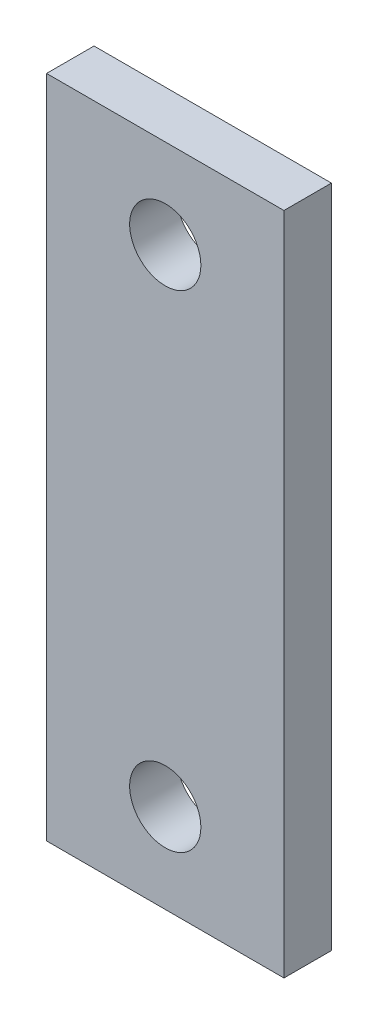
ISO-10303-21;
HEADER;
FILE_DESCRIPTION(('STEP AP214'),'2;1');
FILE_NAME('part.step','',(''),(''),'','','');
FILE_SCHEMA(('AUTOMOTIVE_DESIGN { 1 0 10303 214 1 1 1 1 }'));
ENDSEC;
DATA;
#1=APPLICATION_CONTEXT('core data for automotive mechanical design processes');
#2=APPLICATION_PROTOCOL_DEFINITION('international standard','automotive_design',2000,#1);
#3=PRODUCT_CONTEXT('',#1,'mechanical');
#4=PRODUCT('Part','Part','',(#3));
#5=PRODUCT_RELATED_PRODUCT_CATEGORY('part','',(#4));
#6=PRODUCT_DEFINITION_FORMATION('','',#4);
#7=PRODUCT_DEFINITION_CONTEXT('part definition',#1,'design');
#8=PRODUCT_DEFINITION('design','',#6,#7);
#9=PRODUCT_DEFINITION_SHAPE('','',#8);
#10=(LENGTH_UNIT() NAMED_UNIT(*) SI_UNIT(.MILLI.,.METRE.));
#11=(NAMED_UNIT(*) PLANE_ANGLE_UNIT() SI_UNIT($,.RADIAN.));
#12=(NAMED_UNIT(*) SI_UNIT($,.STERADIAN.) SOLID_ANGLE_UNIT());
#13=UNCERTAINTY_MEASURE_WITH_UNIT(LENGTH_MEASURE(1.E-05),#10,'distance_accuracy_value','');
#14=(GEOMETRIC_REPRESENTATION_CONTEXT(3) GLOBAL_UNCERTAINTY_ASSIGNED_CONTEXT((#13)) GLOBAL_UNIT_ASSIGNED_CONTEXT((#10,
#11,#12)) REPRESENTATION_CONTEXT('',''));
#15=CARTESIAN_POINT('',(0.,0.,0.));
#16=DIRECTION('',(0.,0.,1.));
#17=DIRECTION('',(1.,0.,0.));
#18=AXIS2_PLACEMENT_3D('',#15,#16,#17);
#19=CARTESIAN_POINT('',(15.2003440715172,13.7604472929724,35.));
#20=DIRECTION('',(-1.,0.,0.));
#21=DIRECTION('',(0.,0.,1.));
#22=AXIS2_PLACEMENT_3D('',#19,#20,#21);
#23=PLANE('',#22);
#24=DIRECTION('',(0.,-1.,0.));
#25=VECTOR('',#24,1.);
#26=CARTESIAN_POINT('',(15.2003440715172,19.7604472929724,4.));
#27=LINE('',#26,#25);
#28=CARTESIAN_POINT('',(15.2003440715172,34.7604472929724,4.));
#29=VERTEX_POINT('',#28);
#30=CARTESIAN_POINT('',(15.2003440715172,-21.2395527070276,4.));
#31=VERTEX_POINT('',#30);
#32=EDGE_CURVE('E83',#29,#31,#27,.T.);
#33=ORIENTED_EDGE('',*,*,#32,.T.);
#34=DIRECTION('',(0.,0.,-1.));
#35=VECTOR('',#34,1.);
#36=CARTESIAN_POINT('',(15.2003440715172,-21.2395527070276,0.));
#37=LINE('',#36,#35);
#38=CARTESIAN_POINT('',(15.2003440715172,-21.2395527070276,0.));
#39=VERTEX_POINT('',#38);
#40=EDGE_CURVE('E91',#31,#39,#37,.T.);
#41=ORIENTED_EDGE('',*,*,#40,.T.);
#42=DIRECTION('',(0.,1.,0.));
#43=VECTOR('',#42,1.);
#44=CARTESIAN_POINT('',(15.2003440715172,13.7604472929724,0.));
#45=LINE('',#44,#43);
#46=CARTESIAN_POINT('',(15.2003440715172,34.7604472929724,0.));
#47=VERTEX_POINT('',#46);
#48=EDGE_CURVE('E41',#39,#47,#45,.T.);
#49=ORIENTED_EDGE('',*,*,#48,.T.);
#50=DIRECTION('',(0.,0.,-1.));
#51=VECTOR('',#50,1.);
#52=CARTESIAN_POINT('',(15.2003440715172,34.7604472929724,0.));
#53=LINE('',#52,#51);
#54=EDGE_CURVE('E102',#29,#47,#53,.T.);
#55=ORIENTED_EDGE('',*,*,#54,.F.);
#56=EDGE_LOOP('',(#33,#41,#49,#55));
#57=FACE_BOUND('',#56,.T.);
#58=ADVANCED_FACE('F34',(#57),#23,.F.);
#59=CARTESIAN_POINT('',(-4.79965592848278,-6.23955270702759,35.));
#60=DIRECTION('',(1.,0.,0.));
#61=DIRECTION('',(0.,1.,0.));
#62=AXIS2_PLACEMENT_3D('',#59,#60,#61);
#63=PLANE('',#62);
#64=DIRECTION('',(0.,0.,1.));
#65=VECTOR('',#64,1.);
#66=CARTESIAN_POINT('',(-4.79965592848278,-21.2395527070276,0.));
#67=LINE('',#66,#65);
#68=CARTESIAN_POINT('',(-4.79965592848278,-21.2395527070276,0.));
#69=VERTEX_POINT('',#68);
#70=CARTESIAN_POINT('',(-4.79965592848278,-21.2395527070276,4.));
#71=VERTEX_POINT('',#70);
#72=EDGE_CURVE('E89',#69,#71,#67,.T.);
#73=ORIENTED_EDGE('',*,*,#72,.T.);
#74=DIRECTION('',(0.,-1.,0.));
#75=VECTOR('',#74,1.);
#76=CARTESIAN_POINT('',(-4.79965592848278,34.7604472929724,4.));
#77=LINE('',#76,#75);
#78=CARTESIAN_POINT('',(-4.79965592848278,34.7604472929724,4.));
#79=VERTEX_POINT('',#78);
#80=EDGE_CURVE('E74',#79,#71,#77,.T.);
#81=ORIENTED_EDGE('',*,*,#80,.F.);
#82=DIRECTION('',(0.,0.,1.));
#83=VECTOR('',#82,1.);
#84=CARTESIAN_POINT('',(-4.79965592848278,34.7604472929724,0.));
#85=LINE('',#84,#83);
#86=CARTESIAN_POINT('',(-4.79965592848278,34.7604472929724,0.));
#87=VERTEX_POINT('',#86);
#88=EDGE_CURVE('E48',#87,#79,#85,.T.);
#89=ORIENTED_EDGE('',*,*,#88,.F.);
#90=DIRECTION('',(0.,-1.,0.));
#91=VECTOR('',#90,1.);
#92=CARTESIAN_POINT('',(-4.79965592848278,-6.23955270702759,0.));
#93=LINE('',#92,#91);
#94=EDGE_CURVE('E11',#87,#69,#93,.T.);
#95=ORIENTED_EDGE('',*,*,#94,.T.);
#96=EDGE_LOOP('',(#73,#81,#89,#95));
#97=FACE_BOUND('',#96,.T.);
#98=ADVANCED_FACE('F94',(#97),#63,.F.);
#99=CARTESIAN_POINT('',(0.,0.,0.));
#100=DIRECTION('',(0.,0.,-1.));
#101=DIRECTION('',(-1.,0.,0.));
#102=AXIS2_PLACEMENT_3D('',#99,#100,#101);
#103=PLANE('',#102);
#104=CARTESIAN_POINT('',(5.20034407151722,27.2604472929724,0.));
#105=DIRECTION('',(0.,0.,-1.));
#106=DIRECTION('',(-1.,0.,0.));
#107=AXIS2_PLACEMENT_3D('',#104,#105,#106);
#108=CIRCLE('',#107,3.);
#109=CARTESIAN_POINT('',(2.20034407151722,27.2604472929724,0.));
#110=VERTEX_POINT('',#109);
#111=EDGE_CURVE('E235',#110,#110,#108,.T.);
#112=ORIENTED_EDGE('',*,*,#111,.F.);
#113=EDGE_LOOP('',(#112));
#114=FACE_BOUND('',#113,.T.);
#115=CARTESIAN_POINT('',(5.20034407151722,-13.7395527070276,0.));
#116=DIRECTION('',(0.,0.,-1.));
#117=DIRECTION('',(-1.,0.,0.));
#118=AXIS2_PLACEMENT_3D('',#115,#116,#117);
#119=CIRCLE('',#118,3.);
#120=CARTESIAN_POINT('',(2.20034407151722,-13.7395527070276,0.));
#121=VERTEX_POINT('',#120);
#122=EDGE_CURVE('E92',#121,#121,#119,.T.);
#123=ORIENTED_EDGE('',*,*,#122,.F.);
#124=EDGE_LOOP('',(#123));
#125=FACE_BOUND('',#124,.T.);
#126=ORIENTED_EDGE('',*,*,#48,.F.);
#127=DIRECTION('',(-1.,0.,0.));
#128=VECTOR('',#127,1.);
#129=CARTESIAN_POINT('',(0.,-21.2395527070276,0.));
#130=LINE('',#129,#128);
#131=EDGE_CURVE('E95',#39,#69,#130,.T.);
#132=ORIENTED_EDGE('',*,*,#131,.T.);
#133=ORIENTED_EDGE('',*,*,#94,.F.);
#134=DIRECTION('',(-1.,0.,0.));
#135=VECTOR('',#134,1.);
#136=CARTESIAN_POINT('',(0.,34.7604472929724,0.));
#137=LINE('',#136,#135);
#138=EDGE_CURVE('E105',#47,#87,#137,.T.);
#139=ORIENTED_EDGE('',*,*,#138,.F.);
#140=EDGE_LOOP('',(#126,#132,#133,#139));
#141=FACE_BOUND('',#140,.T.);
#142=ADVANCED_FACE('F111',(#114,#125,#141),#103,.T.);
#143=CARTESIAN_POINT('',(0.,34.7604472929724,4.));
#144=DIRECTION('',(0.,0.,1.));
#145=DIRECTION('',(1.,0.,0.));
#146=AXIS2_PLACEMENT_3D('',#143,#144,#145);
#147=PLANE('',#146);
#148=ORIENTED_EDGE('',*,*,#32,.F.);
#149=DIRECTION('',(-1.,0.,0.));
#150=VECTOR('',#149,1.);
#151=CARTESIAN_POINT('',(0.,34.7604472929724,4.));
#152=LINE('',#151,#150);
#153=EDGE_CURVE('E80',#29,#79,#152,.T.);
#154=ORIENTED_EDGE('',*,*,#153,.T.);
#155=ORIENTED_EDGE('',*,*,#80,.T.);
#156=DIRECTION('',(-1.,0.,0.));
#157=VECTOR('',#156,1.);
#158=CARTESIAN_POINT('',(0.,-21.2395527070276,4.));
#159=LINE('',#158,#157);
#160=EDGE_CURVE('E78',#31,#71,#159,.T.);
#161=ORIENTED_EDGE('',*,*,#160,.F.);
#162=EDGE_LOOP('',(#148,#154,#155,#161));
#163=FACE_BOUND('',#162,.T.);
#164=CARTESIAN_POINT('',(5.20034407151722,27.2604472929724,4.));
#165=DIRECTION('',(0.,0.,1.));
#166=DIRECTION('',(1.,0.,0.));
#167=AXIS2_PLACEMENT_3D('',#164,#165,#166);
#168=CIRCLE('',#167,3.);
#169=CARTESIAN_POINT('',(8.20034407151723,27.2604472929724,4.));
#170=VERTEX_POINT('',#169);
#171=EDGE_CURVE('E238',#170,#170,#168,.T.);
#172=ORIENTED_EDGE('',*,*,#171,.F.);
#173=EDGE_LOOP('',(#172));
#174=FACE_BOUND('',#173,.T.);
#175=CARTESIAN_POINT('',(5.20034407151722,-13.7395527070276,4.));
#176=DIRECTION('',(0.,0.,1.));
#177=DIRECTION('',(1.,0.,0.));
#178=AXIS2_PLACEMENT_3D('',#175,#176,#177);
#179=CIRCLE('',#178,3.);
#180=CARTESIAN_POINT('',(8.20034407151723,-13.7395527070276,4.));
#181=VERTEX_POINT('',#180);
#182=EDGE_CURVE('E240',#181,#181,#179,.T.);
#183=ORIENTED_EDGE('',*,*,#182,.F.);
#184=EDGE_LOOP('',(#183));
#185=FACE_BOUND('',#184,.T.);
#186=ADVANCED_FACE('F76',(#163,#174,#185),#147,.T.);
#187=CARTESIAN_POINT('',(0.,34.7604472929724,0.));
#188=DIRECTION('',(0.,1.,0.));
#189=DIRECTION('',(0.,0.,1.));
#190=AXIS2_PLACEMENT_3D('',#187,#188,#189);
#191=PLANE('',#190);
#192=ORIENTED_EDGE('',*,*,#153,.F.);
#193=ORIENTED_EDGE('',*,*,#54,.T.);
#194=ORIENTED_EDGE('',*,*,#138,.T.);
#195=ORIENTED_EDGE('',*,*,#88,.T.);
#196=EDGE_LOOP('',(#192,#193,#194,#195));
#197=FACE_BOUND('',#196,.T.);
#198=ADVANCED_FACE('F110',(#197),#191,.T.);
#199=CARTESIAN_POINT('',(0.,-21.2395527070276,0.));
#200=DIRECTION('',(0.,-1.,0.));
#201=DIRECTION('',(0.,0.,1.));
#202=AXIS2_PLACEMENT_3D('',#199,#200,#201);
#203=PLANE('',#202);
#204=ORIENTED_EDGE('',*,*,#160,.T.);
#205=ORIENTED_EDGE('',*,*,#72,.F.);
#206=ORIENTED_EDGE('',*,*,#131,.F.);
#207=ORIENTED_EDGE('',*,*,#40,.F.);
#208=EDGE_LOOP('',(#204,#205,#206,#207));
#209=FACE_BOUND('',#208,.T.);
#210=ADVANCED_FACE('F87',(#209),#203,.T.);
#211=CARTESIAN_POINT('',(5.20034407151722,-13.7395527070276,-11.));
#212=DIRECTION('',(0.,0.,1.));
#213=DIRECTION('',(1.,0.,0.));
#214=AXIS2_PLACEMENT_3D('',#211,#212,#213);
#215=CYLINDRICAL_SURFACE('',#214,3.);
#216=ORIENTED_EDGE('',*,*,#122,.T.);
#217=EDGE_LOOP('',(#216));
#218=FACE_BOUND('',#217,.T.);
#219=ORIENTED_EDGE('',*,*,#182,.T.);
#220=EDGE_LOOP('',(#219));
#221=FACE_BOUND('',#220,.T.);
#222=ADVANCED_FACE('F204',(#218,#221),#215,.F.);
#223=CARTESIAN_POINT('',(5.20034407151722,27.2604472929724,-11.));
#224=DIRECTION('',(0.,0.,1.));
#225=DIRECTION('',(1.,0.,0.));
#226=AXIS2_PLACEMENT_3D('',#223,#224,#225);
#227=CYLINDRICAL_SURFACE('',#226,3.);
#228=ORIENTED_EDGE('',*,*,#111,.T.);
#229=EDGE_LOOP('',(#228));
#230=FACE_BOUND('',#229,.T.);
#231=ORIENTED_EDGE('',*,*,#171,.T.);
#232=EDGE_LOOP('',(#231));
#233=FACE_BOUND('',#232,.T.);
#234=ADVANCED_FACE('F130',(#230,#233),#227,.F.);
#235=CLOSED_SHELL('',(#58,#98,#142,#186,#198,#210,#222,#234));
#236=MANIFOLD_SOLID_BREP('B2',#235);
#237=ADVANCED_BREP_SHAPE_REPRESENTATION('',(#18,#236),#14);
#238=SHAPE_DEFINITION_REPRESENTATION(#9,#237);
ENDSEC;
END-ISO-10303-21;
